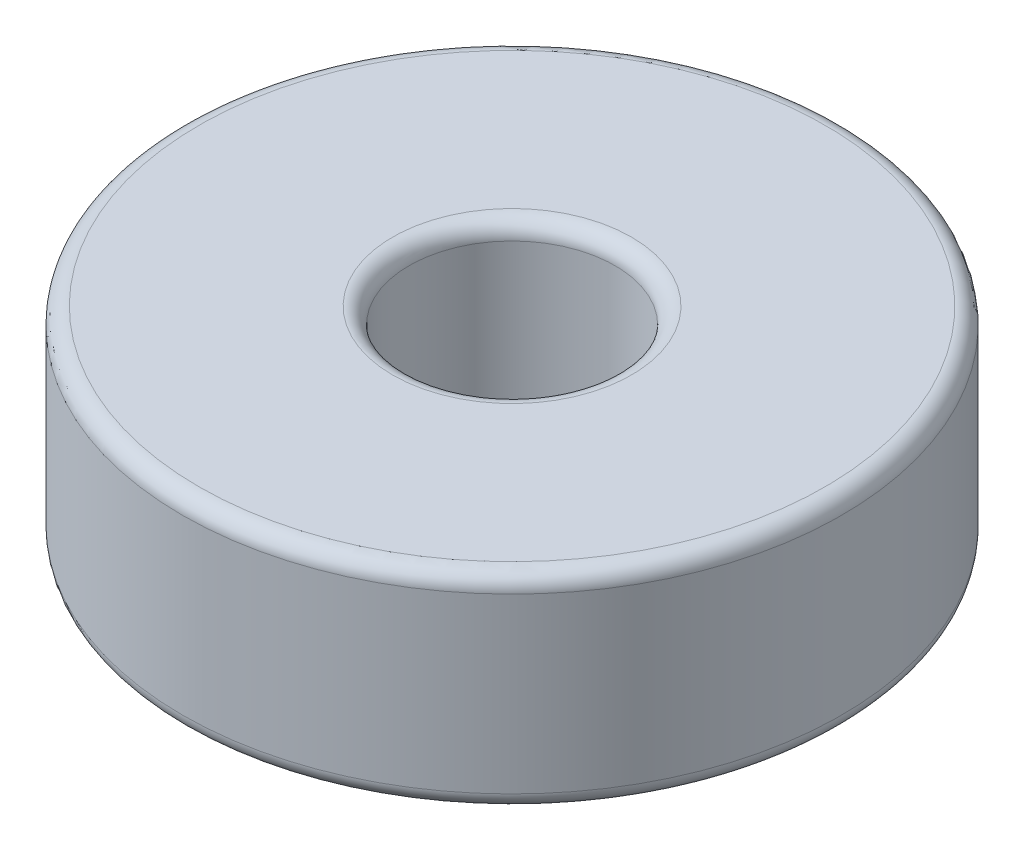
ISO-10303-21;
HEADER;
FILE_DESCRIPTION(('STEP AP214'),'2;1');
FILE_NAME('part.step','',(''),(''),'','','');
FILE_SCHEMA(('AUTOMOTIVE_DESIGN { 1 0 10303 214 1 1 1 1 }'));
ENDSEC;
DATA;
#1=APPLICATION_CONTEXT('core data for automotive mechanical design processes');
#2=APPLICATION_PROTOCOL_DEFINITION('international standard','automotive_design',2000,#1);
#3=PRODUCT_CONTEXT('',#1,'mechanical');
#4=PRODUCT('Part','Part','',(#3));
#5=PRODUCT_RELATED_PRODUCT_CATEGORY('part','',(#4));
#6=PRODUCT_DEFINITION_FORMATION('','',#4);
#7=PRODUCT_DEFINITION_CONTEXT('part definition',#1,'design');
#8=PRODUCT_DEFINITION('design','',#6,#7);
#9=PRODUCT_DEFINITION_SHAPE('','',#8);
#10=(LENGTH_UNIT() NAMED_UNIT(*) SI_UNIT(.MILLI.,.METRE.));
#11=(NAMED_UNIT(*) PLANE_ANGLE_UNIT() SI_UNIT($,.RADIAN.));
#12=(NAMED_UNIT(*) SI_UNIT($,.STERADIAN.) SOLID_ANGLE_UNIT());
#13=UNCERTAINTY_MEASURE_WITH_UNIT(LENGTH_MEASURE(1.E-05),#10,'distance_accuracy_value','');
#14=(GEOMETRIC_REPRESENTATION_CONTEXT(3) GLOBAL_UNCERTAINTY_ASSIGNED_CONTEXT((#13)) GLOBAL_UNIT_ASSIGNED_CONTEXT((#10,
#11,#12)) REPRESENTATION_CONTEXT('',''));
#15=CARTESIAN_POINT('',(0.,0.,0.));
#16=DIRECTION('',(0.,0.,1.));
#17=DIRECTION('',(1.,0.,0.));
#18=AXIS2_PLACEMENT_3D('',#15,#16,#17);
#19=CARTESIAN_POINT('',(0.,5.,0.));
#20=DIRECTION('',(0.,1.,0.));
#21=DIRECTION('',(0.,0.,1.));
#22=AXIS2_PLACEMENT_3D('',#19,#20,#21);
#23=PLANE('',#22);
#24=CARTESIAN_POINT('',(0.,5.,0.));
#25=DIRECTION('',(0.,1.,0.));
#26=DIRECTION('',(0.,0.,1.));
#27=AXIS2_PLACEMENT_3D('',#24,#25,#26);
#28=CIRCLE('',#27,2.9);
#29=CARTESIAN_POINT('',(0.,5.,2.9));
#30=VERTEX_POINT('',#29);
#31=EDGE_CURVE('E10',#30,#30,#28,.F.);
#32=ORIENTED_EDGE('',*,*,#31,.T.);
#33=EDGE_LOOP('',(#32));
#34=FACE_BOUND('',#33,.T.);
#35=CARTESIAN_POINT('',(0.,5.,0.));
#36=DIRECTION('',(0.,1.,0.));
#37=DIRECTION('',(0.,0.,1.));
#38=AXIS2_PLACEMENT_3D('',#35,#36,#37);
#39=CIRCLE('',#38,7.6);
#40=CARTESIAN_POINT('',(0.,5.,7.6));
#41=VERTEX_POINT('',#40);
#42=EDGE_CURVE('E38',#41,#41,#39,.T.);
#43=ORIENTED_EDGE('',*,*,#42,.T.);
#44=EDGE_LOOP('',(#43));
#45=FACE_BOUND('',#44,.T.);
#46=ADVANCED_FACE('F31',(#34,#45),#23,.T.);
#47=CARTESIAN_POINT('',(0.,0.,0.));
#48=DIRECTION('',(0.,1.,0.));
#49=DIRECTION('',(0.,0.,1.));
#50=AXIS2_PLACEMENT_3D('',#47,#48,#49);
#51=PLANE('',#50);
#52=CARTESIAN_POINT('',(0.,0.,0.));
#53=DIRECTION('',(0.,1.,0.));
#54=DIRECTION('',(0.,0.,1.));
#55=AXIS2_PLACEMENT_3D('',#52,#53,#54);
#56=CIRCLE('',#55,2.9);
#57=CARTESIAN_POINT('',(0.,0.,2.9));
#58=VERTEX_POINT('',#57);
#59=EDGE_CURVE('E57',#58,#58,#56,.T.);
#60=ORIENTED_EDGE('',*,*,#59,.T.);
#61=EDGE_LOOP('',(#60));
#62=FACE_BOUND('',#61,.T.);
#63=CARTESIAN_POINT('',(0.,0.,0.));
#64=DIRECTION('',(0.,1.,0.));
#65=DIRECTION('',(0.,0.,1.));
#66=AXIS2_PLACEMENT_3D('',#63,#64,#65);
#67=CIRCLE('',#66,7.6);
#68=CARTESIAN_POINT('',(0.,0.,7.6));
#69=VERTEX_POINT('',#68);
#70=EDGE_CURVE('E60',#69,#69,#67,.F.);
#71=ORIENTED_EDGE('',*,*,#70,.T.);
#72=EDGE_LOOP('',(#71));
#73=FACE_BOUND('',#72,.T.);
#74=ADVANCED_FACE('F64',(#62,#73),#51,.F.);
#75=CARTESIAN_POINT('',(0.,5.,0.));
#76=DIRECTION('',(0.,-1.,0.));
#77=DIRECTION('',(0.,0.,-1.));
#78=AXIS2_PLACEMENT_3D('',#75,#76,#77);
#79=CYLINDRICAL_SURFACE('',#78,8.);
#80=CARTESIAN_POINT('',(0.,0.4,0.));
#81=DIRECTION('',(0.,1.,0.));
#82=DIRECTION('',(0.,0.,1.));
#83=AXIS2_PLACEMENT_3D('',#80,#81,#82);
#84=CIRCLE('',#83,8.);
#85=CARTESIAN_POINT('',(0.,0.4,8.));
#86=VERTEX_POINT('',#85);
#87=EDGE_CURVE('E42',#86,#86,#84,.T.);
#88=ORIENTED_EDGE('',*,*,#87,.T.);
#89=EDGE_LOOP('',(#88));
#90=FACE_BOUND('',#89,.T.);
#91=CARTESIAN_POINT('',(0.,4.6,0.));
#92=DIRECTION('',(0.,1.,0.));
#93=DIRECTION('',(0.,0.,1.));
#94=AXIS2_PLACEMENT_3D('',#91,#92,#93);
#95=CIRCLE('',#94,8.);
#96=CARTESIAN_POINT('',(0.,4.6,8.));
#97=VERTEX_POINT('',#96);
#98=EDGE_CURVE('E46',#97,#97,#95,.F.);
#99=ORIENTED_EDGE('',*,*,#98,.T.);
#100=EDGE_LOOP('',(#99));
#101=FACE_BOUND('',#100,.T.);
#102=ADVANCED_FACE('F74',(#90,#101),#79,.T.);
#103=CARTESIAN_POINT('',(0.,5.,0.));
#104=DIRECTION('',(0.,-1.,0.));
#105=DIRECTION('',(0.,0.,-1.));
#106=AXIS2_PLACEMENT_3D('',#103,#104,#105);
#107=CYLINDRICAL_SURFACE('',#106,2.5);
#108=CARTESIAN_POINT('',(0.,0.4,0.));
#109=DIRECTION('',(0.,1.,0.));
#110=DIRECTION('',(0.,0.,1.));
#111=AXIS2_PLACEMENT_3D('',#108,#109,#110);
#112=CIRCLE('',#111,2.5);
#113=CARTESIAN_POINT('',(0.,0.4,2.5));
#114=VERTEX_POINT('',#113);
#115=EDGE_CURVE('E51',#114,#114,#112,.F.);
#116=ORIENTED_EDGE('',*,*,#115,.T.);
#117=EDGE_LOOP('',(#116));
#118=FACE_BOUND('',#117,.T.);
#119=CARTESIAN_POINT('',(0.,4.6,0.));
#120=DIRECTION('',(0.,1.,0.));
#121=DIRECTION('',(0.,0.,1.));
#122=AXIS2_PLACEMENT_3D('',#119,#120,#121);
#123=CIRCLE('',#122,2.5);
#124=CARTESIAN_POINT('',(0.,4.6,2.5));
#125=VERTEX_POINT('',#124);
#126=EDGE_CURVE('E54',#125,#125,#123,.T.);
#127=ORIENTED_EDGE('',*,*,#126,.T.);
#128=EDGE_LOOP('',(#127));
#129=FACE_BOUND('',#128,.T.);
#130=ADVANCED_FACE('F77',(#118,#129),#107,.F.);
#131=CARTESIAN_POINT('',(0.,0.4,0.));
#132=DIRECTION('',(0.,1.,0.));
#133=DIRECTION('',(0.,0.,1.));
#134=AXIS2_PLACEMENT_3D('',#131,#132,#133);
#135=TOROIDAL_SURFACE('',#134,2.9,0.4);
#136=ORIENTED_EDGE('',*,*,#115,.F.);
#137=EDGE_LOOP('',(#136));
#138=FACE_BOUND('',#137,.T.);
#139=ORIENTED_EDGE('',*,*,#59,.F.);
#140=EDGE_LOOP('',(#139));
#141=FACE_BOUND('',#140,.T.);
#142=ADVANCED_FACE('F70',(#138,#141),#135,.T.);
#143=CARTESIAN_POINT('',(0.,0.4,0.));
#144=DIRECTION('',(0.,1.,0.));
#145=DIRECTION('',(0.,0.,1.));
#146=AXIS2_PLACEMENT_3D('',#143,#144,#145);
#147=TOROIDAL_SURFACE('',#146,7.6,0.4);
#148=ORIENTED_EDGE('',*,*,#70,.F.);
#149=EDGE_LOOP('',(#148));
#150=FACE_BOUND('',#149,.T.);
#151=ORIENTED_EDGE('',*,*,#87,.F.);
#152=EDGE_LOOP('',(#151));
#153=FACE_BOUND('',#152,.T.);
#154=ADVANCED_FACE('F66',(#150,#153),#147,.T.);
#155=CARTESIAN_POINT('',(0.,4.6,0.));
#156=DIRECTION('',(0.,1.,0.));
#157=DIRECTION('',(0.,0.,1.));
#158=AXIS2_PLACEMENT_3D('',#155,#156,#157);
#159=TOROIDAL_SURFACE('',#158,2.9,0.4);
#160=ORIENTED_EDGE('',*,*,#31,.F.);
#161=EDGE_LOOP('',(#160));
#162=FACE_BOUND('',#161,.T.);
#163=ORIENTED_EDGE('',*,*,#126,.F.);
#164=EDGE_LOOP('',(#163));
#165=FACE_BOUND('',#164,.T.);
#166=ADVANCED_FACE('F69',(#162,#165),#159,.T.);
#167=CARTESIAN_POINT('',(0.,4.6,0.));
#168=DIRECTION('',(0.,1.,0.));
#169=DIRECTION('',(0.,0.,1.));
#170=AXIS2_PLACEMENT_3D('',#167,#168,#169);
#171=TOROIDAL_SURFACE('',#170,7.6,0.4);
#172=ORIENTED_EDGE('',*,*,#98,.F.);
#173=EDGE_LOOP('',(#172));
#174=FACE_BOUND('',#173,.T.);
#175=ORIENTED_EDGE('',*,*,#42,.F.);
#176=EDGE_LOOP('',(#175));
#177=FACE_BOUND('',#176,.T.);
#178=ADVANCED_FACE('F33',(#174,#177),#171,.T.);
#179=CLOSED_SHELL('',(#46,#74,#102,#130,#142,#154,#166,#178));
#180=MANIFOLD_SOLID_BREP('B2',#179);
#181=ADVANCED_BREP_SHAPE_REPRESENTATION('',(#18,#180),#14);
#182=SHAPE_DEFINITION_REPRESENTATION(#9,#181);
ENDSEC;
END-ISO-10303-21;
